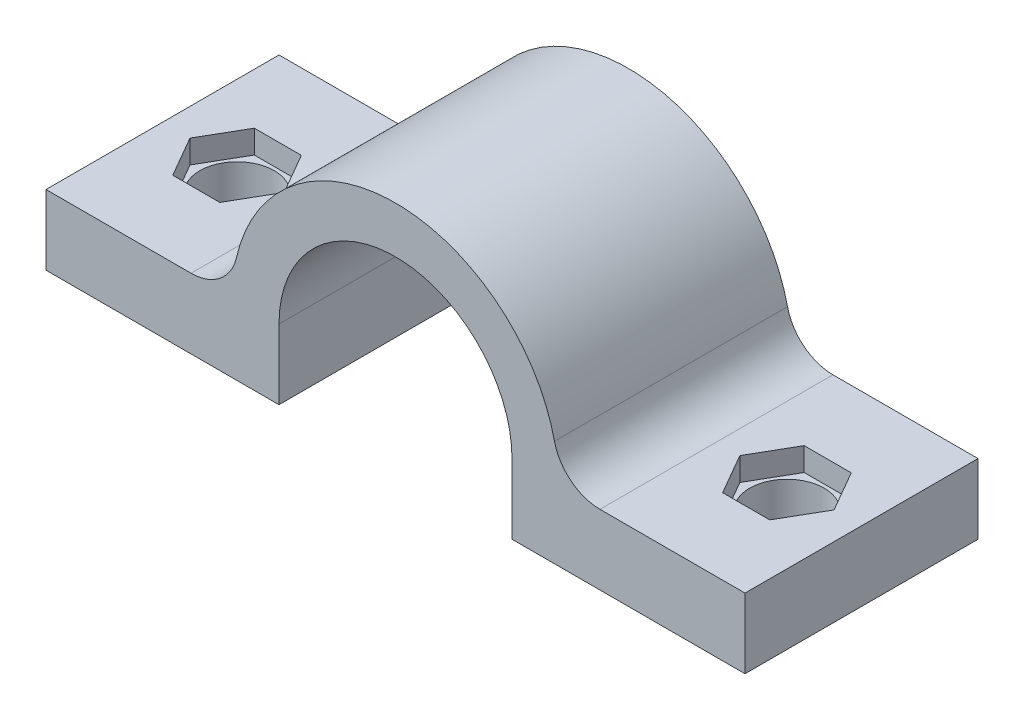
ISO-10303-21;
HEADER;
FILE_DESCRIPTION(('STEP AP214'),'2;1');
FILE_NAME('part.step','',(''),(''),'','','');
FILE_SCHEMA(('AUTOMOTIVE_DESIGN { 1 0 10303 214 1 1 1 1 }'));
ENDSEC;
DATA;
#1=APPLICATION_CONTEXT('core data for automotive mechanical design processes');
#2=APPLICATION_PROTOCOL_DEFINITION('international standard','automotive_design',2000,#1);
#3=PRODUCT_CONTEXT('',#1,'mechanical');
#4=PRODUCT('Part','Part','',(#3));
#5=PRODUCT_RELATED_PRODUCT_CATEGORY('part','',(#4));
#6=PRODUCT_DEFINITION_FORMATION('','',#4);
#7=PRODUCT_DEFINITION_CONTEXT('part definition',#1,'design');
#8=PRODUCT_DEFINITION('design','',#6,#7);
#9=PRODUCT_DEFINITION_SHAPE('','',#8);
#10=(LENGTH_UNIT() NAMED_UNIT(*) SI_UNIT(.MILLI.,.METRE.));
#11=(NAMED_UNIT(*) PLANE_ANGLE_UNIT() SI_UNIT($,.RADIAN.));
#12=(NAMED_UNIT(*) SI_UNIT($,.STERADIAN.) SOLID_ANGLE_UNIT());
#13=UNCERTAINTY_MEASURE_WITH_UNIT(LENGTH_MEASURE(1.E-05),#10,'distance_accuracy_value','');
#14=(GEOMETRIC_REPRESENTATION_CONTEXT(3) GLOBAL_UNCERTAINTY_ASSIGNED_CONTEXT((#13)) GLOBAL_UNIT_ASSIGNED_CONTEXT((#10,
#11,#12)) REPRESENTATION_CONTEXT('',''));
#15=CARTESIAN_POINT('',(0.,0.,0.));
#16=DIRECTION('',(0.,0.,1.));
#17=DIRECTION('',(1.,0.,0.));
#18=AXIS2_PLACEMENT_3D('',#15,#16,#17);
#19=CARTESIAN_POINT('',(11.8,-2.99999999999999,5.));
#20=DIRECTION('',(0.,1.,0.));
#21=DIRECTION('',(-1.,0.,0.));
#22=AXIS2_PLACEMENT_3D('',#19,#20,#21);
#23=CYLINDRICAL_SURFACE('',#22,1.6);
#24=CARTESIAN_POINT('',(11.8,-2.99999999999999,5.));
#25=DIRECTION('',(0.,1.,0.));
#26=DIRECTION('',(-1.,0.,0.));
#27=AXIS2_PLACEMENT_3D('',#24,#25,#26);
#28=CIRCLE('',#27,1.6);
#29=CARTESIAN_POINT('',(10.2,-2.99999999999999,5.));
#30=VERTEX_POINT('',#29);
#31=EDGE_CURVE('E301',#30,#30,#28,.T.);
#32=CARTESIAN_POINT('',(11.8,-1.,5.));
#33=DIRECTION('',(0.,1.,0.));
#34=DIRECTION('',(-1.,0.,0.));
#35=AXIS2_PLACEMENT_3D('',#32,#33,#34);
#36=CIRCLE('',#35,1.6);
#37=CARTESIAN_POINT('',(10.2,-1.,5.));
#38=VERTEX_POINT('',#37);
#39=EDGE_CURVE('E41',#38,#38,#36,.F.);
#40=CARTESIAN_POINT('',(10.2,-2.99999999999999,5.));
#41=CARTESIAN_POINT('',(10.2,-2.97916666666665,5.));
#42=CARTESIAN_POINT('',(10.2,-2.95833333333332,5.));
#43=CARTESIAN_POINT('',(10.2,-2.91666666666665,5.));
#44=CARTESIAN_POINT('',(10.2,-2.89583333333332,5.));
#45=CARTESIAN_POINT('',(10.2,-2.85416666666665,5.));
#46=CARTESIAN_POINT('',(10.2,-2.83333333333332,5.));
#47=CARTESIAN_POINT('',(10.2,-2.79166666666665,5.));
#48=CARTESIAN_POINT('',(10.2,-2.77083333333332,5.));
#49=CARTESIAN_POINT('',(10.2,-2.72916666666665,5.));
#50=CARTESIAN_POINT('',(10.2,-2.70833333333332,5.));
#51=CARTESIAN_POINT('',(10.2,-2.66666666666665,5.));
#52=CARTESIAN_POINT('',(10.2,-2.64583333333332,5.));
#53=CARTESIAN_POINT('',(10.2,-2.60416666666666,5.));
#54=CARTESIAN_POINT('',(10.2,-2.58333333333332,5.));
#55=CARTESIAN_POINT('',(10.2,-2.54166666666666,5.));
#56=CARTESIAN_POINT('',(10.2,-2.52083333333332,5.));
#57=CARTESIAN_POINT('',(10.2,-2.47916666666666,5.));
#58=CARTESIAN_POINT('',(10.2,-2.45833333333332,5.));
#59=CARTESIAN_POINT('',(10.2,-2.41666666666666,5.));
#60=CARTESIAN_POINT('',(10.2,-2.39583333333332,5.));
#61=CARTESIAN_POINT('',(10.2,-2.35416666666666,5.));
#62=CARTESIAN_POINT('',(10.2,-2.33333333333332,5.));
#63=CARTESIAN_POINT('',(10.2,-2.29166666666666,5.));
#64=CARTESIAN_POINT('',(10.2,-2.27083333333332,5.));
#65=CARTESIAN_POINT('',(10.2,-2.22916666666666,5.));
#66=CARTESIAN_POINT('',(10.2,-2.20833333333332,5.));
#67=CARTESIAN_POINT('',(10.2,-2.16666666666666,5.));
#68=CARTESIAN_POINT('',(10.2,-2.14583333333333,5.));
#69=CARTESIAN_POINT('',(10.2,-2.10416666666666,5.));
#70=CARTESIAN_POINT('',(10.2,-2.08333333333333,5.));
#71=CARTESIAN_POINT('',(10.2,-2.04166666666666,5.));
#72=CARTESIAN_POINT('',(10.2,-2.02083333333333,5.));
#73=CARTESIAN_POINT('',(10.2,-1.97916666666666,5.));
#74=CARTESIAN_POINT('',(10.2,-1.95833333333333,5.));
#75=CARTESIAN_POINT('',(10.2,-1.91666666666666,5.));
#76=CARTESIAN_POINT('',(10.2,-1.89583333333333,5.));
#77=CARTESIAN_POINT('',(10.2,-1.85416666666666,5.));
#78=CARTESIAN_POINT('',(10.2,-1.83333333333333,5.));
#79=CARTESIAN_POINT('',(10.2,-1.79166666666666,5.));
#80=CARTESIAN_POINT('',(10.2,-1.77083333333333,5.));
#81=CARTESIAN_POINT('',(10.2,-1.72916666666666,5.));
#82=CARTESIAN_POINT('',(10.2,-1.70833333333333,5.));
#83=CARTESIAN_POINT('',(10.2,-1.66666666666666,5.));
#84=CARTESIAN_POINT('',(10.2,-1.64583333333333,5.));
#85=CARTESIAN_POINT('',(10.2,-1.60416666666666,5.));
#86=CARTESIAN_POINT('',(10.2,-1.58333333333333,5.));
#87=CARTESIAN_POINT('',(10.2,-1.54166666666666,5.));
#88=CARTESIAN_POINT('',(10.2,-1.52083333333333,5.));
#89=CARTESIAN_POINT('',(10.2,-1.47916666666666,5.));
#90=CARTESIAN_POINT('',(10.2,-1.45833333333333,5.));
#91=CARTESIAN_POINT('',(10.2,-1.41666666666666,5.));
#92=CARTESIAN_POINT('',(10.2,-1.39583333333333,5.));
#93=CARTESIAN_POINT('',(10.2,-1.35416666666666,5.));
#94=CARTESIAN_POINT('',(10.2,-1.33333333333333,5.));
#95=CARTESIAN_POINT('',(10.2,-1.29166666666667,5.));
#96=CARTESIAN_POINT('',(10.2,-1.27083333333333,5.));
#97=CARTESIAN_POINT('',(10.2,-1.22916666666667,5.));
#98=CARTESIAN_POINT('',(10.2,-1.20833333333333,5.));
#99=CARTESIAN_POINT('',(10.2,-1.16666666666667,5.));
#100=CARTESIAN_POINT('',(10.2,-1.14583333333333,5.));
#101=CARTESIAN_POINT('',(10.2,-1.10416666666667,5.));
#102=CARTESIAN_POINT('',(10.2,-1.08333333333333,5.));
#103=CARTESIAN_POINT('',(10.2,-1.04166666666667,5.));
#104=CARTESIAN_POINT('',(10.2,-1.02083333333333,5.));
#105=CARTESIAN_POINT('',(10.2,-1.,5.));
#106=B_SPLINE_CURVE_WITH_KNOTS('',3,(#40,#41,#42,#43,#44,#45,#46,#47,#48,#49,#50,#51,#52,#53,
#54,#55,#56,#57,#58,#59,#60,#61,#62,#63,#64,#65,#66,#67,#68,#69,#70,#71,#72,#73,#74,#75,#76,#77,
#78,#79,#80,#81,#82,#83,#84,#85,#86,#87,#88,#89,#90,#91,#92,#93,#94,#95,#96,#97,#98,#99,#100,
#101,#102,#103,#104,#105),.UNSPECIFIED.,.F.,.F.,(4,2,2,2,2,2,2,2,2,2,2,2,2,2,2,2,2,2,2,2,2,2,2,
2,2,2,2,2,2,2,2,2,4),(0.,0.0624999999999996,0.124999999999999,0.187499999999999,
0.249999999999998,0.312499999999998,0.374999999999997,0.437499999999997,0.499999999999997,
0.562499999999996,0.624999999999995,0.687499999999995,0.749999999999995,0.812499999999994,
0.874999999999993,0.937499999999993,0.999999999999993,1.06249999999999,1.12499999999999,
1.18749999999999,1.24999999999999,1.31249999999999,1.37499999999999,1.43749999999999,
1.49999999999999,1.56249999999999,1.62499999999999,1.68749999999999,1.74999999999999,
1.81249999999999,1.87499999999999,1.93749999999999,1.99999999999998),.UNSPECIFIED.);
#107=EDGE_CURVE('BSEAM37',#30,#38,#106,.T.);
#108=ORIENTED_EDGE('',*,*,#31,.F.);
#109=ORIENTED_EDGE('',*,*,#39,.F.);
#110=ORIENTED_EDGE('',*,*,#107,.T.);
#111=ORIENTED_EDGE('',*,*,#107,.F.);
#112=EDGE_LOOP('',(#108,#110,#109,#111));
#113=FACE_BOUND('',#112,.T.);
#114=ADVANCED_FACE('F37',(#113),#23,.F.);
#115=CARTESIAN_POINT('',(-11.8,-2.99999999999999,5.));
#116=DIRECTION('',(0.,1.,0.));
#117=DIRECTION('',(-1.,0.,0.));
#118=AXIS2_PLACEMENT_3D('',#115,#116,#117);
#119=CYLINDRICAL_SURFACE('',#118,1.6);
#120=CARTESIAN_POINT('',(-11.8,-2.99999999999999,5.));
#121=DIRECTION('',(0.,1.,0.));
#122=DIRECTION('',(1.,0.,0.));
#123=AXIS2_PLACEMENT_3D('',#120,#121,#122);
#124=CIRCLE('',#123,1.6);
#125=CARTESIAN_POINT('',(-13.4,-2.99999999999999,5.));
#126=VERTEX_POINT('',#125);
#127=EDGE_CURVE('E305',#126,#126,#124,.T.);
#128=CARTESIAN_POINT('',(-11.8,-0.999999999999999,5.));
#129=DIRECTION('',(0.,1.,0.));
#130=DIRECTION('',(-1.,0.,0.));
#131=AXIS2_PLACEMENT_3D('',#128,#129,#130);
#132=CIRCLE('',#131,1.6);
#133=CARTESIAN_POINT('',(-13.4,-0.999999999999999,5.));
#134=VERTEX_POINT('',#133);
#135=EDGE_CURVE('E248',#134,#134,#132,.F.);
#136=CARTESIAN_POINT('',(-13.4,-2.99999999999999,5.));
#137=CARTESIAN_POINT('',(-13.4,-2.97916666666665,5.));
#138=CARTESIAN_POINT('',(-13.4,-2.95833333333332,5.));
#139=CARTESIAN_POINT('',(-13.4,-2.91666666666665,5.));
#140=CARTESIAN_POINT('',(-13.4,-2.89583333333332,5.));
#141=CARTESIAN_POINT('',(-13.4,-2.85416666666666,5.));
#142=CARTESIAN_POINT('',(-13.4,-2.83333333333332,5.));
#143=CARTESIAN_POINT('',(-13.4,-2.79166666666666,5.));
#144=CARTESIAN_POINT('',(-13.4,-2.77083333333332,5.));
#145=CARTESIAN_POINT('',(-13.4,-2.72916666666666,5.));
#146=CARTESIAN_POINT('',(-13.4,-2.70833333333332,5.));
#147=CARTESIAN_POINT('',(-13.4,-2.66666666666666,5.));
#148=CARTESIAN_POINT('',(-13.4,-2.64583333333332,5.));
#149=CARTESIAN_POINT('',(-13.4,-2.60416666666666,5.));
#150=CARTESIAN_POINT('',(-13.4,-2.58333333333332,5.));
#151=CARTESIAN_POINT('',(-13.4,-2.54166666666666,5.));
#152=CARTESIAN_POINT('',(-13.4,-2.52083333333332,5.));
#153=CARTESIAN_POINT('',(-13.4,-2.47916666666666,5.));
#154=CARTESIAN_POINT('',(-13.4,-2.45833333333332,5.));
#155=CARTESIAN_POINT('',(-13.4,-2.41666666666666,5.));
#156=CARTESIAN_POINT('',(-13.4,-2.39583333333332,5.));
#157=CARTESIAN_POINT('',(-13.4,-2.35416666666666,5.));
#158=CARTESIAN_POINT('',(-13.4,-2.33333333333333,5.));
#159=CARTESIAN_POINT('',(-13.4,-2.29166666666666,5.));
#160=CARTESIAN_POINT('',(-13.4,-2.27083333333333,5.));
#161=CARTESIAN_POINT('',(-13.4,-2.22916666666666,5.));
#162=CARTESIAN_POINT('',(-13.4,-2.20833333333333,5.));
#163=CARTESIAN_POINT('',(-13.4,-2.16666666666666,5.));
#164=CARTESIAN_POINT('',(-13.4,-2.14583333333333,5.));
#165=CARTESIAN_POINT('',(-13.4,-2.10416666666666,5.));
#166=CARTESIAN_POINT('',(-13.4,-2.08333333333333,5.));
#167=CARTESIAN_POINT('',(-13.4,-2.04166666666666,5.));
#168=CARTESIAN_POINT('',(-13.4,-2.02083333333333,5.));
#169=CARTESIAN_POINT('',(-13.4,-1.97916666666666,5.));
#170=CARTESIAN_POINT('',(-13.4,-1.95833333333333,5.));
#171=CARTESIAN_POINT('',(-13.4,-1.91666666666666,5.));
#172=CARTESIAN_POINT('',(-13.4,-1.89583333333333,5.));
#173=CARTESIAN_POINT('',(-13.4,-1.85416666666666,5.));
#174=CARTESIAN_POINT('',(-13.4,-1.83333333333333,5.));
#175=CARTESIAN_POINT('',(-13.4,-1.79166666666666,5.));
#176=CARTESIAN_POINT('',(-13.4,-1.77083333333333,5.));
#177=CARTESIAN_POINT('',(-13.4,-1.72916666666666,5.));
#178=CARTESIAN_POINT('',(-13.4,-1.70833333333333,5.));
#179=CARTESIAN_POINT('',(-13.4,-1.66666666666666,5.));
#180=CARTESIAN_POINT('',(-13.4,-1.64583333333333,5.));
#181=CARTESIAN_POINT('',(-13.4,-1.60416666666666,5.));
#182=CARTESIAN_POINT('',(-13.4,-1.58333333333333,5.));
#183=CARTESIAN_POINT('',(-13.4,-1.54166666666666,5.));
#184=CARTESIAN_POINT('',(-13.4,-1.52083333333333,5.));
#185=CARTESIAN_POINT('',(-13.4,-1.47916666666666,5.));
#186=CARTESIAN_POINT('',(-13.4,-1.45833333333333,5.));
#187=CARTESIAN_POINT('',(-13.4,-1.41666666666666,5.));
#188=CARTESIAN_POINT('',(-13.4,-1.39583333333333,5.));
#189=CARTESIAN_POINT('',(-13.4,-1.35416666666666,5.));
#190=CARTESIAN_POINT('',(-13.4,-1.33333333333333,5.));
#191=CARTESIAN_POINT('',(-13.4,-1.29166666666666,5.));
#192=CARTESIAN_POINT('',(-13.4,-1.27083333333333,5.));
#193=CARTESIAN_POINT('',(-13.4,-1.22916666666666,5.));
#194=CARTESIAN_POINT('',(-13.4,-1.20833333333333,5.));
#195=CARTESIAN_POINT('',(-13.4,-1.16666666666666,5.));
#196=CARTESIAN_POINT('',(-13.4,-1.14583333333333,5.));
#197=CARTESIAN_POINT('',(-13.4,-1.10416666666666,5.));
#198=CARTESIAN_POINT('',(-13.4,-1.08333333333333,5.));
#199=CARTESIAN_POINT('',(-13.4,-1.04166666666666,5.));
#200=CARTESIAN_POINT('',(-13.4,-1.02083333333333,5.));
#201=CARTESIAN_POINT('',(-13.4,-0.999999999999999,5.));
#202=B_SPLINE_CURVE_WITH_KNOTS('',3,(#136,#137,#138,#139,#140,#141,#142,#143,#144,#145,#146,
#147,#148,#149,#150,#151,#152,#153,#154,#155,#156,#157,#158,#159,#160,#161,#162,#163,#164,#165,
#166,#167,#168,#169,#170,#171,#172,#173,#174,#175,#176,#177,#178,#179,#180,#181,#182,#183,#184,
#185,#186,#187,#188,#189,#190,#191,#192,#193,#194,#195,#196,#197,#198,#199,#200,#201),
.UNSPECIFIED.,.F.,.F.,(4,2,2,2,2,2,2,2,2,2,2,2,2,2,2,2,2,2,2,2,2,2,2,2,2,2,2,2,2,2,2,2,4),(0.,
0.0625000000000001,0.125,0.187499999999999,0.249999999999999,0.312499999999999,
0.374999999999998,0.437499999999998,0.499999999999997,0.562499999999997,0.624999999999997,
0.687499999999997,0.749999999999996,0.812499999999996,0.874999999999996,0.937499999999995,
0.999999999999995,1.06249999999999,1.12499999999999,1.18749999999999,1.24999999999999,
1.31249999999999,1.37499999999999,1.43749999999999,1.49999999999999,1.56249999999999,
1.62499999999999,1.68749999999999,1.74999999999999,1.81249999999999,1.87499999999999,
1.93749999999999,1.99999999999999),.UNSPECIFIED.);
#203=EDGE_CURVE('BSEAM398',#126,#134,#202,.T.);
#204=ORIENTED_EDGE('',*,*,#127,.F.);
#205=ORIENTED_EDGE('',*,*,#135,.F.);
#206=ORIENTED_EDGE('',*,*,#203,.T.);
#207=ORIENTED_EDGE('',*,*,#203,.F.);
#208=EDGE_LOOP('',(#204,#206,#205,#207));
#209=FACE_BOUND('',#208,.T.);
#210=ADVANCED_FACE('F398',(#209),#119,.F.);
#211=CARTESIAN_POINT('',(0.,0.,10.));
#212=DIRECTION('',(0.,-1.,0.));
#213=DIRECTION('',(1.,0.,0.));
#214=AXIS2_PLACEMENT_3D('',#211,#212,#213);
#215=PLANE('',#214);
#216=DIRECTION('',(1.,0.,0.));
#217=VECTOR('',#216,1.);
#218=CARTESIAN_POINT('',(-12.8103629710818,0.,6.75));
#219=LINE('',#218,#217);
#220=CARTESIAN_POINT('',(-12.8103629710818,0.,6.75));
#221=VERTEX_POINT('',#220);
#222=CARTESIAN_POINT('',(-10.7896370289181,0.,6.75));
#223=VERTEX_POINT('',#222);
#224=EDGE_CURVE('E277',#221,#223,#219,.T.);
#225=ORIENTED_EDGE('',*,*,#224,.F.);
#226=DIRECTION('',(0.5,0.,0.866025403784438));
#227=VECTOR('',#226,1.);
#228=CARTESIAN_POINT('',(-13.8207259421637,0.,5.));
#229=LINE('',#228,#227);
#230=CARTESIAN_POINT('',(-13.8207259421637,0.,5.));
#231=VERTEX_POINT('',#230);
#232=EDGE_CURVE('E54',#231,#221,#229,.T.);
#233=ORIENTED_EDGE('',*,*,#232,.F.);
#234=DIRECTION('',(-0.5,0.,0.866025403784438));
#235=VECTOR('',#234,1.);
#236=CARTESIAN_POINT('',(-12.8103629710818,0.,3.25));
#237=LINE('',#236,#235);
#238=CARTESIAN_POINT('',(-12.8103629710818,0.,3.25));
#239=VERTEX_POINT('',#238);
#240=EDGE_CURVE('E260',#239,#231,#237,.T.);
#241=ORIENTED_EDGE('',*,*,#240,.F.);
#242=DIRECTION('',(-1.,0.,0.));
#243=VECTOR('',#242,1.);
#244=CARTESIAN_POINT('',(-10.7896370289182,0.,3.25));
#245=LINE('',#244,#243);
#246=CARTESIAN_POINT('',(-10.7896370289182,0.,3.25));
#247=VERTEX_POINT('',#246);
#248=EDGE_CURVE('E286',#247,#239,#245,.T.);
#249=ORIENTED_EDGE('',*,*,#248,.F.);
#250=DIRECTION('',(-0.500000000000001,0.,-0.866025403784438));
#251=VECTOR('',#250,1.);
#252=CARTESIAN_POINT('',(-9.7792740578363,0.,5.));
#253=LINE('',#252,#251);
#254=CARTESIAN_POINT('',(-9.7792740578363,0.,5.));
#255=VERTEX_POINT('',#254);
#256=EDGE_CURVE('E283',#255,#247,#253,.T.);
#257=ORIENTED_EDGE('',*,*,#256,.F.);
#258=DIRECTION('',(0.5,0.,-0.866025403784439));
#259=VECTOR('',#258,1.);
#260=CARTESIAN_POINT('',(-10.7896370289181,0.,6.75));
#261=LINE('',#260,#259);
#262=EDGE_CURVE('E280',#223,#255,#261,.T.);
#263=ORIENTED_EDGE('',*,*,#262,.F.);
#264=EDGE_LOOP('',(#225,#233,#241,#249,#257,#263));
#265=FACE_BOUND('',#264,.T.);
#266=DIRECTION('',(-1.,0.,0.));
#267=VECTOR('',#266,1.);
#268=CARTESIAN_POINT('',(0.,0.,10.));
#269=LINE('',#268,#267);
#270=CARTESIAN_POINT('',(-8.77496438739212,0.,10.));
#271=VERTEX_POINT('',#270);
#272=CARTESIAN_POINT('',(-15.,0.,10.));
#273=VERTEX_POINT('',#272);
#274=EDGE_CURVE('E308',#271,#273,#269,.T.);
#275=ORIENTED_EDGE('',*,*,#274,.F.);
#276=DIRECTION('',(0.,0.,-1.));
#277=VECTOR('',#276,1.);
#278=CARTESIAN_POINT('',(-8.77496438739212,0.,10.));
#279=LINE('',#278,#277);
#280=CARTESIAN_POINT('',(-8.77496438739212,0.,0.));
#281=VERTEX_POINT('',#280);
#282=EDGE_CURVE('E384',#271,#281,#279,.T.);
#283=ORIENTED_EDGE('',*,*,#282,.T.);
#284=DIRECTION('',(-1.,0.,0.));
#285=VECTOR('',#284,1.);
#286=CARTESIAN_POINT('',(0.,0.,0.));
#287=LINE('',#286,#285);
#288=CARTESIAN_POINT('',(-15.,0.,0.));
#289=VERTEX_POINT('',#288);
#290=EDGE_CURVE('E304',#281,#289,#287,.T.);
#291=ORIENTED_EDGE('',*,*,#290,.T.);
#292=DIRECTION('',(0.,0.,-1.));
#293=VECTOR('',#292,1.);
#294=CARTESIAN_POINT('',(-15.,0.,10.));
#295=LINE('',#294,#293);
#296=EDGE_CURVE('E374',#273,#289,#295,.T.);
#297=ORIENTED_EDGE('',*,*,#296,.F.);
#298=EDGE_LOOP('',(#275,#283,#291,#297));
#299=FACE_BOUND('',#298,.T.);
#300=ADVANCED_FACE('F404',(#265,#299),#215,.F.);
#301=CARTESIAN_POINT('',(-15.,0.,10.));
#302=DIRECTION('',(1.,0.,0.));
#303=DIRECTION('',(0.,0.,-1.));
#304=AXIS2_PLACEMENT_3D('',#301,#302,#303);
#305=PLANE('',#304);
#306=DIRECTION('',(0.,-1.,0.));
#307=VECTOR('',#306,1.);
#308=CARTESIAN_POINT('',(-15.,0.,0.));
#309=LINE('',#308,#307);
#310=CARTESIAN_POINT('',(-15.,-2.99999999999998,0.));
#311=VERTEX_POINT('',#310);
#312=EDGE_CURVE('E335',#289,#311,#309,.T.);
#313=ORIENTED_EDGE('',*,*,#312,.T.);
#314=DIRECTION('',(0.,0.,-1.));
#315=VECTOR('',#314,1.);
#316=CARTESIAN_POINT('',(-15.,-2.99999999999998,10.));
#317=LINE('',#316,#315);
#318=CARTESIAN_POINT('',(-15.,-2.99999999999998,10.));
#319=VERTEX_POINT('',#318);
#320=EDGE_CURVE('E372',#319,#311,#317,.T.);
#321=ORIENTED_EDGE('',*,*,#320,.F.);
#322=DIRECTION('',(0.,-1.,0.));
#323=VECTOR('',#322,1.);
#324=CARTESIAN_POINT('',(-15.,0.,10.));
#325=LINE('',#324,#323);
#326=EDGE_CURVE('E310',#273,#319,#325,.T.);
#327=ORIENTED_EDGE('',*,*,#326,.F.);
#328=ORIENTED_EDGE('',*,*,#296,.T.);
#329=EDGE_LOOP('',(#313,#321,#327,#328));
#330=FACE_BOUND('',#329,.T.);
#331=ADVANCED_FACE('F452',(#330),#305,.F.);
#332=CARTESIAN_POINT('',(0.,-2.99999999999998,10.));
#333=DIRECTION('',(0.,-1.,0.));
#334=DIRECTION('',(1.,0.,0.));
#335=AXIS2_PLACEMENT_3D('',#332,#333,#334);
#336=PLANE('',#335);
#337=ORIENTED_EDGE('',*,*,#127,.T.);
#338=EDGE_LOOP('',(#337));
#339=FACE_BOUND('',#338,.T.);
#340=DIRECTION('',(-1.,0.,0.));
#341=VECTOR('',#340,1.);
#342=CARTESIAN_POINT('',(0.,-2.99999999999998,0.));
#343=LINE('',#342,#341);
#344=CARTESIAN_POINT('',(-5.,-2.99999999999998,0.));
#345=VERTEX_POINT('',#344);
#346=EDGE_CURVE('E338',#345,#311,#343,.T.);
#347=ORIENTED_EDGE('',*,*,#346,.F.);
#348=DIRECTION('',(0.,0.,-1.));
#349=VECTOR('',#348,1.);
#350=CARTESIAN_POINT('',(-5.,-2.99999999999998,10.));
#351=LINE('',#350,#349);
#352=CARTESIAN_POINT('',(-5.,-2.99999999999998,10.));
#353=VERTEX_POINT('',#352);
#354=EDGE_CURVE('E370',#353,#345,#351,.T.);
#355=ORIENTED_EDGE('',*,*,#354,.F.);
#356=DIRECTION('',(-1.,0.,0.));
#357=VECTOR('',#356,1.);
#358=CARTESIAN_POINT('',(0.,-2.99999999999998,10.));
#359=LINE('',#358,#357);
#360=EDGE_CURVE('E313',#353,#319,#359,.T.);
#361=ORIENTED_EDGE('',*,*,#360,.T.);
#362=ORIENTED_EDGE('',*,*,#320,.T.);
#363=EDGE_LOOP('',(#347,#355,#361,#362));
#364=FACE_BOUND('',#363,.T.);
#365=ADVANCED_FACE('F448',(#339,#364),#336,.T.);
#366=CARTESIAN_POINT('',(-5.,0.,10.));
#367=DIRECTION('',(1.,0.,0.));
#368=DIRECTION('',(0.,0.,-1.));
#369=AXIS2_PLACEMENT_3D('',#366,#367,#368);
#370=PLANE('',#369);
#371=DIRECTION('',(0.,-1.,0.));
#372=VECTOR('',#371,1.);
#373=CARTESIAN_POINT('',(-5.,0.,0.));
#374=LINE('',#373,#372);
#375=CARTESIAN_POINT('',(-5.,0.,0.));
#376=VERTEX_POINT('',#375);
#377=EDGE_CURVE('E341',#376,#345,#374,.T.);
#378=ORIENTED_EDGE('',*,*,#377,.F.);
#379=DIRECTION('',(0.,0.,-1.));
#380=VECTOR('',#379,1.);
#381=CARTESIAN_POINT('',(-5.,0.,10.));
#382=LINE('',#381,#380);
#383=CARTESIAN_POINT('',(-5.,0.,10.));
#384=VERTEX_POINT('',#383);
#385=EDGE_CURVE('E368',#384,#376,#382,.T.);
#386=ORIENTED_EDGE('',*,*,#385,.F.);
#387=DIRECTION('',(0.,-1.,0.));
#388=VECTOR('',#387,1.);
#389=CARTESIAN_POINT('',(-5.,0.,10.));
#390=LINE('',#389,#388);
#391=EDGE_CURVE('E316',#384,#353,#390,.T.);
#392=ORIENTED_EDGE('',*,*,#391,.T.);
#393=ORIENTED_EDGE('',*,*,#354,.T.);
#394=EDGE_LOOP('',(#378,#386,#392,#393));
#395=FACE_BOUND('',#394,.T.);
#396=ADVANCED_FACE('F444',(#395),#370,.T.);
#397=CARTESIAN_POINT('',(0.,0.,10.));
#398=DIRECTION('',(0.,0.,-1.));
#399=DIRECTION('',(-1.,0.,0.));
#400=AXIS2_PLACEMENT_3D('',#397,#398,#399);
#401=CYLINDRICAL_SURFACE('',#400,5.);
#402=CARTESIAN_POINT('',(0.,0.,0.));
#403=DIRECTION('',(0.,0.,1.));
#404=DIRECTION('',(1.,0.,0.));
#405=AXIS2_PLACEMENT_3D('',#402,#403,#404);
#406=CIRCLE('',#405,5.);
#407=CARTESIAN_POINT('',(5.,0.,0.));
#408=VERTEX_POINT('',#407);
#409=EDGE_CURVE('E344',#376,#408,#406,.F.);
#410=ORIENTED_EDGE('',*,*,#409,.T.);
#411=DIRECTION('',(0.,0.,-1.));
#412=VECTOR('',#411,1.);
#413=CARTESIAN_POINT('',(5.,0.,10.));
#414=LINE('',#413,#412);
#415=CARTESIAN_POINT('',(5.,0.,10.));
#416=VERTEX_POINT('',#415);
#417=EDGE_CURVE('E365',#416,#408,#414,.T.);
#418=ORIENTED_EDGE('',*,*,#417,.F.);
#419=CARTESIAN_POINT('',(0.,0.,10.));
#420=DIRECTION('',(0.,0.,1.));
#421=DIRECTION('',(1.,0.,0.));
#422=AXIS2_PLACEMENT_3D('',#419,#420,#421);
#423=CIRCLE('',#422,5.);
#424=EDGE_CURVE('E319',#384,#416,#423,.F.);
#425=ORIENTED_EDGE('',*,*,#424,.F.);
#426=ORIENTED_EDGE('',*,*,#385,.T.);
#427=EDGE_LOOP('',(#410,#418,#425,#426));
#428=FACE_BOUND('',#427,.T.);
#429=ADVANCED_FACE('F440',(#428),#401,.F.);
#430=CARTESIAN_POINT('',(5.,0.,10.));
#431=DIRECTION('',(1.,0.,0.));
#432=DIRECTION('',(0.,0.,-1.));
#433=AXIS2_PLACEMENT_3D('',#430,#431,#432);
#434=PLANE('',#433);
#435=DIRECTION('',(0.,-1.,0.));
#436=VECTOR('',#435,1.);
#437=CARTESIAN_POINT('',(5.,0.,0.));
#438=LINE('',#437,#436);
#439=CARTESIAN_POINT('',(5.,-2.99999999999998,0.));
#440=VERTEX_POINT('',#439);
#441=EDGE_CURVE('E346',#408,#440,#438,.T.);
#442=ORIENTED_EDGE('',*,*,#441,.T.);
#443=DIRECTION('',(0.,0.,-1.));
#444=VECTOR('',#443,1.);
#445=CARTESIAN_POINT('',(5.,-2.99999999999998,10.));
#446=LINE('',#445,#444);
#447=CARTESIAN_POINT('',(5.,-2.99999999999998,10.));
#448=VERTEX_POINT('',#447);
#449=EDGE_CURVE('E362',#448,#440,#446,.T.);
#450=ORIENTED_EDGE('',*,*,#449,.F.);
#451=DIRECTION('',(0.,-1.,0.));
#452=VECTOR('',#451,1.);
#453=CARTESIAN_POINT('',(5.,0.,10.));
#454=LINE('',#453,#452);
#455=EDGE_CURVE('E321',#416,#448,#454,.T.);
#456=ORIENTED_EDGE('',*,*,#455,.F.);
#457=ORIENTED_EDGE('',*,*,#417,.T.);
#458=EDGE_LOOP('',(#442,#450,#456,#457));
#459=FACE_BOUND('',#458,.T.);
#460=ADVANCED_FACE('F436',(#459),#434,.F.);
#461=CARTESIAN_POINT('',(0.,-2.99999999999998,10.));
#462=DIRECTION('',(0.,1.,0.));
#463=DIRECTION('',(0.,0.,1.));
#464=AXIS2_PLACEMENT_3D('',#461,#462,#463);
#465=PLANE('',#464);
#466=ORIENTED_EDGE('',*,*,#31,.T.);
#467=EDGE_LOOP('',(#466));
#468=FACE_BOUND('',#467,.T.);
#469=DIRECTION('',(1.,0.,0.));
#470=VECTOR('',#469,1.);
#471=CARTESIAN_POINT('',(0.,-2.99999999999998,0.));
#472=LINE('',#471,#470);
#473=CARTESIAN_POINT('',(15.,-2.99999999999998,0.));
#474=VERTEX_POINT('',#473);
#475=EDGE_CURVE('E348',#440,#474,#472,.T.);
#476=ORIENTED_EDGE('',*,*,#475,.T.);
#477=DIRECTION('',(0.,0.,-1.));
#478=VECTOR('',#477,1.);
#479=CARTESIAN_POINT('',(15.,-2.99999999999998,10.));
#480=LINE('',#479,#478);
#481=CARTESIAN_POINT('',(15.,-2.99999999999998,10.));
#482=VERTEX_POINT('',#481);
#483=EDGE_CURVE('E360',#482,#474,#480,.T.);
#484=ORIENTED_EDGE('',*,*,#483,.F.);
#485=DIRECTION('',(1.,0.,0.));
#486=VECTOR('',#485,1.);
#487=CARTESIAN_POINT('',(0.,-2.99999999999998,10.));
#488=LINE('',#487,#486);
#489=EDGE_CURVE('E323',#448,#482,#488,.T.);
#490=ORIENTED_EDGE('',*,*,#489,.F.);
#491=ORIENTED_EDGE('',*,*,#449,.T.);
#492=EDGE_LOOP('',(#476,#484,#490,#491));
#493=FACE_BOUND('',#492,.T.);
#494=ADVANCED_FACE('F432',(#468,#493),#465,.F.);
#495=CARTESIAN_POINT('',(15.,0.,10.));
#496=DIRECTION('',(1.,0.,0.));
#497=DIRECTION('',(0.,0.,-1.));
#498=AXIS2_PLACEMENT_3D('',#495,#496,#497);
#499=PLANE('',#498);
#500=DIRECTION('',(0.,-1.,0.));
#501=VECTOR('',#500,1.);
#502=CARTESIAN_POINT('',(15.,0.,0.));
#503=LINE('',#502,#501);
#504=CARTESIAN_POINT('',(15.,0.,0.));
#505=VERTEX_POINT('',#504);
#506=EDGE_CURVE('E351',#505,#474,#503,.T.);
#507=ORIENTED_EDGE('',*,*,#506,.F.);
#508=DIRECTION('',(0.,0.,-1.));
#509=VECTOR('',#508,1.);
#510=CARTESIAN_POINT('',(15.,0.,10.));
#511=LINE('',#510,#509);
#512=CARTESIAN_POINT('',(15.,0.,10.));
#513=VERTEX_POINT('',#512);
#514=EDGE_CURVE('E333',#513,#505,#511,.T.);
#515=ORIENTED_EDGE('',*,*,#514,.F.);
#516=DIRECTION('',(0.,-1.,0.));
#517=VECTOR('',#516,1.);
#518=CARTESIAN_POINT('',(15.,0.,10.));
#519=LINE('',#518,#517);
#520=EDGE_CURVE('E325',#513,#482,#519,.T.);
#521=ORIENTED_EDGE('',*,*,#520,.T.);
#522=ORIENTED_EDGE('',*,*,#483,.T.);
#523=EDGE_LOOP('',(#507,#515,#521,#522));
#524=FACE_BOUND('',#523,.T.);
#525=ADVANCED_FACE('F428',(#524),#499,.T.);
#526=CARTESIAN_POINT('',(0.,0.,10.));
#527=DIRECTION('',(0.,1.,0.));
#528=DIRECTION('',(-1.,0.,0.));
#529=AXIS2_PLACEMENT_3D('',#526,#527,#528);
#530=PLANE('',#529);
#531=DIRECTION('',(0.500000000000001,0.,0.866025403784438));
#532=VECTOR('',#531,1.);
#533=CARTESIAN_POINT('',(9.77927405783631,0.,5.));
#534=LINE('',#533,#532);
#535=CARTESIAN_POINT('',(9.77927405783631,0.,5.));
#536=VERTEX_POINT('',#535);
#537=CARTESIAN_POINT('',(10.7896370289182,0.,6.75));
#538=VERTEX_POINT('',#537);
#539=EDGE_CURVE('E62',#536,#538,#534,.T.);
#540=ORIENTED_EDGE('',*,*,#539,.F.);
#541=DIRECTION('',(-0.5,0.,0.866025403784439));
#542=VECTOR('',#541,1.);
#543=CARTESIAN_POINT('',(10.7896370289182,0.,3.25));
#544=LINE('',#543,#542);
#545=CARTESIAN_POINT('',(10.7896370289182,0.,3.25));
#546=VERTEX_POINT('',#545);
#547=EDGE_CURVE('E221',#546,#536,#544,.T.);
#548=ORIENTED_EDGE('',*,*,#547,.F.);
#549=DIRECTION('',(-1.,0.,0.));
#550=VECTOR('',#549,1.);
#551=CARTESIAN_POINT('',(12.8103629710818,0.,3.25));
#552=LINE('',#551,#550);
#553=CARTESIAN_POINT('',(12.8103629710818,0.,3.25));
#554=VERTEX_POINT('',#553);
#555=EDGE_CURVE('E224',#554,#546,#552,.T.);
#556=ORIENTED_EDGE('',*,*,#555,.F.);
#557=DIRECTION('',(-0.5,0.,-0.866025403784439));
#558=VECTOR('',#557,1.);
#559=CARTESIAN_POINT('',(13.8207259421637,0.,5.));
#560=LINE('',#559,#558);
#561=CARTESIAN_POINT('',(13.8207259421637,0.,5.));
#562=VERTEX_POINT('',#561);
#563=EDGE_CURVE('E241',#562,#554,#560,.T.);
#564=ORIENTED_EDGE('',*,*,#563,.F.);
#565=DIRECTION('',(0.5,0.,-0.866025403784439));
#566=VECTOR('',#565,1.);
#567=CARTESIAN_POINT('',(12.8103629710818,0.,6.75));
#568=LINE('',#567,#566);
#569=CARTESIAN_POINT('',(12.8103629710818,0.,6.75));
#570=VERTEX_POINT('',#569);
#571=EDGE_CURVE('E238',#570,#562,#568,.T.);
#572=ORIENTED_EDGE('',*,*,#571,.F.);
#573=DIRECTION('',(1.,0.,0.));
#574=VECTOR('',#573,1.);
#575=CARTESIAN_POINT('',(10.7896370289182,0.,6.75));
#576=LINE('',#575,#574);
#577=EDGE_CURVE('E235',#538,#570,#576,.T.);
#578=ORIENTED_EDGE('',*,*,#577,.F.);
#579=EDGE_LOOP('',(#540,#548,#556,#564,#572,#578));
#580=FACE_BOUND('',#579,.T.);
#581=DIRECTION('',(1.,0.,0.));
#582=VECTOR('',#581,1.);
#583=CARTESIAN_POINT('',(0.,0.,0.));
#584=LINE('',#583,#582);
#585=CARTESIAN_POINT('',(8.77496438739212,0.,0.));
#586=VERTEX_POINT('',#585);
#587=EDGE_CURVE('E354',#586,#505,#584,.T.);
#588=ORIENTED_EDGE('',*,*,#587,.F.);
#589=DIRECTION('',(0.,0.,1.));
#590=VECTOR('',#589,1.);
#591=CARTESIAN_POINT('',(8.77496438739212,0.,10.));
#592=LINE('',#591,#590);
#593=CARTESIAN_POINT('',(8.77496438739212,0.,10.));
#594=VERTEX_POINT('',#593);
#595=EDGE_CURVE('E382',#586,#594,#592,.T.);
#596=ORIENTED_EDGE('',*,*,#595,.T.);
#597=DIRECTION('',(1.,0.,0.));
#598=VECTOR('',#597,1.);
#599=CARTESIAN_POINT('',(0.,0.,10.));
#600=LINE('',#599,#598);
#601=EDGE_CURVE('E328',#594,#513,#600,.T.);
#602=ORIENTED_EDGE('',*,*,#601,.T.);
#603=ORIENTED_EDGE('',*,*,#514,.T.);
#604=EDGE_LOOP('',(#588,#596,#602,#603));
#605=FACE_BOUND('',#604,.T.);
#606=ADVANCED_FACE('F424',(#580,#605),#530,.T.);
#607=CARTESIAN_POINT('',(0.,0.,10.));
#608=DIRECTION('',(0.,0.,-1.));
#609=DIRECTION('',(-1.,0.,0.));
#610=AXIS2_PLACEMENT_3D('',#607,#608,#609);
#611=CYLINDRICAL_SURFACE('',#610,7.);
#612=CARTESIAN_POINT('',(0.,0.,10.));
#613=DIRECTION('',(0.,0.,1.));
#614=DIRECTION('',(1.,0.,0.));
#615=AXIS2_PLACEMENT_3D('',#612,#613,#614);
#616=CIRCLE('',#615,7.);
#617=CARTESIAN_POINT('',(-6.82497230130498,1.55555555555555,10.));
#618=VERTEX_POINT('',#617);
#619=CARTESIAN_POINT('',(6.82497230130498,1.55555555555555,10.));
#620=VERTEX_POINT('',#619);
#621=EDGE_CURVE('E330',#618,#620,#616,.F.);
#622=ORIENTED_EDGE('',*,*,#621,.T.);
#623=DIRECTION('',(0.,0.,-1.));
#624=VECTOR('',#623,1.);
#625=CARTESIAN_POINT('',(6.82497230130498,1.55555555555555,10.));
#626=LINE('',#625,#624);
#627=CARTESIAN_POINT('',(6.82497230130498,1.55555555555555,0.));
#628=VERTEX_POINT('',#627);
#629=EDGE_CURVE('E379',#620,#628,#626,.T.);
#630=ORIENTED_EDGE('',*,*,#629,.T.);
#631=CARTESIAN_POINT('',(0.,0.,0.));
#632=DIRECTION('',(0.,0.,1.));
#633=DIRECTION('',(1.,0.,0.));
#634=AXIS2_PLACEMENT_3D('',#631,#632,#633);
#635=CIRCLE('',#634,7.);
#636=CARTESIAN_POINT('',(-6.82497230130498,1.55555555555555,0.));
#637=VERTEX_POINT('',#636);
#638=EDGE_CURVE('E311',#637,#628,#635,.F.);
#639=ORIENTED_EDGE('',*,*,#638,.F.);
#640=DIRECTION('',(0.,0.,-1.));
#641=VECTOR('',#640,1.);
#642=CARTESIAN_POINT('',(-6.82497230130498,1.55555555555555,10.));
#643=LINE('',#642,#641);
#644=EDGE_CURVE('E377',#637,#618,#643,.F.);
#645=ORIENTED_EDGE('',*,*,#644,.T.);
#646=EDGE_LOOP('',(#622,#630,#639,#645));
#647=FACE_BOUND('',#646,.T.);
#648=ADVANCED_FACE('F416',(#647),#611,.T.);
#649=CARTESIAN_POINT('',(0.,0.,10.));
#650=DIRECTION('',(0.,0.,1.));
#651=DIRECTION('',(1.,0.,0.));
#652=AXIS2_PLACEMENT_3D('',#649,#650,#651);
#653=PLANE('',#652);
#654=ORIENTED_EDGE('',*,*,#621,.F.);
#655=CARTESIAN_POINT('',(-8.77496438739212,2.,10.));
#656=DIRECTION('',(0.,0.,1.));
#657=DIRECTION('',(1.,0.,0.));
#658=AXIS2_PLACEMENT_3D('',#655,#656,#657);
#659=CIRCLE('',#658,2.);
#660=EDGE_CURVE('E11',#618,#271,#659,.F.);
#661=ORIENTED_EDGE('',*,*,#660,.T.);
#662=ORIENTED_EDGE('',*,*,#274,.T.);
#663=ORIENTED_EDGE('',*,*,#326,.T.);
#664=ORIENTED_EDGE('',*,*,#360,.F.);
#665=ORIENTED_EDGE('',*,*,#391,.F.);
#666=ORIENTED_EDGE('',*,*,#424,.T.);
#667=ORIENTED_EDGE('',*,*,#455,.T.);
#668=ORIENTED_EDGE('',*,*,#489,.T.);
#669=ORIENTED_EDGE('',*,*,#520,.F.);
#670=ORIENTED_EDGE('',*,*,#601,.F.);
#671=CARTESIAN_POINT('',(8.77496438739212,2.,10.));
#672=DIRECTION('',(0.,0.,1.));
#673=DIRECTION('',(1.,0.,0.));
#674=AXIS2_PLACEMENT_3D('',#671,#672,#673);
#675=CIRCLE('',#674,2.);
#676=EDGE_CURVE('E389',#594,#620,#675,.F.);
#677=ORIENTED_EDGE('',*,*,#676,.T.);
#678=EDGE_LOOP('',(#654,#661,#662,#663,#664,#665,#666,#667,#668,#669,#670,#677));
#679=FACE_BOUND('',#678,.T.);
#680=ADVANCED_FACE('F412',(#679),#653,.T.);
#681=CARTESIAN_POINT('',(0.,0.,0.));
#682=DIRECTION('',(0.,0.,1.));
#683=DIRECTION('',(1.,0.,0.));
#684=AXIS2_PLACEMENT_3D('',#681,#682,#683);
#685=PLANE('',#684);
#686=ORIENTED_EDGE('',*,*,#290,.F.);
#687=CARTESIAN_POINT('',(-8.77496438739212,2.,0.));
#688=DIRECTION('',(0.,0.,1.));
#689=DIRECTION('',(1.,0.,0.));
#690=AXIS2_PLACEMENT_3D('',#687,#688,#689);
#691=CIRCLE('',#690,2.);
#692=EDGE_CURVE('E46',#281,#637,#691,.T.);
#693=ORIENTED_EDGE('',*,*,#692,.T.);
#694=ORIENTED_EDGE('',*,*,#638,.T.);
#695=CARTESIAN_POINT('',(8.77496438739212,2.,0.));
#696=DIRECTION('',(0.,0.,1.));
#697=DIRECTION('',(1.,0.,0.));
#698=AXIS2_PLACEMENT_3D('',#695,#696,#697);
#699=CIRCLE('',#698,2.);
#700=EDGE_CURVE('E387',#628,#586,#699,.T.);
#701=ORIENTED_EDGE('',*,*,#700,.T.);
#702=ORIENTED_EDGE('',*,*,#587,.T.);
#703=ORIENTED_EDGE('',*,*,#506,.T.);
#704=ORIENTED_EDGE('',*,*,#475,.F.);
#705=ORIENTED_EDGE('',*,*,#441,.F.);
#706=ORIENTED_EDGE('',*,*,#409,.F.);
#707=ORIENTED_EDGE('',*,*,#377,.T.);
#708=ORIENTED_EDGE('',*,*,#346,.T.);
#709=ORIENTED_EDGE('',*,*,#312,.F.);
#710=EDGE_LOOP('',(#686,#693,#694,#701,#702,#703,#704,#705,#706,#707,#708,#709));
#711=FACE_BOUND('',#710,.T.);
#712=ADVANCED_FACE('F415',(#711),#685,.F.);
#713=CARTESIAN_POINT('',(8.77496438739212,2.,10.));
#714=DIRECTION('',(0.,0.,-1.));
#715=DIRECTION('',(-1.,0.,0.));
#716=AXIS2_PLACEMENT_3D('',#713,#714,#715);
#717=CYLINDRICAL_SURFACE('',#716,2.);
#718=ORIENTED_EDGE('',*,*,#676,.F.);
#719=ORIENTED_EDGE('',*,*,#595,.F.);
#720=ORIENTED_EDGE('',*,*,#700,.F.);
#721=ORIENTED_EDGE('',*,*,#629,.F.);
#722=EDGE_LOOP('',(#718,#719,#720,#721));
#723=FACE_BOUND('',#722,.T.);
#724=ADVANCED_FACE('F420',(#723),#717,.F.);
#725=CARTESIAN_POINT('',(-8.77496438739212,2.,10.));
#726=DIRECTION('',(0.,0.,-1.));
#727=DIRECTION('',(-1.,0.,0.));
#728=AXIS2_PLACEMENT_3D('',#725,#726,#727);
#729=CYLINDRICAL_SURFACE('',#728,2.);
#730=ORIENTED_EDGE('',*,*,#660,.F.);
#731=ORIENTED_EDGE('',*,*,#644,.F.);
#732=ORIENTED_EDGE('',*,*,#692,.F.);
#733=ORIENTED_EDGE('',*,*,#282,.F.);
#734=EDGE_LOOP('',(#730,#731,#732,#733));
#735=FACE_BOUND('',#734,.T.);
#736=ADVANCED_FACE('F39',(#735),#729,.F.);
#737=CARTESIAN_POINT('',(0.,-1.,0.));
#738=DIRECTION('',(0.,1.,0.));
#739=DIRECTION('',(-1.,0.,0.));
#740=AXIS2_PLACEMENT_3D('',#737,#738,#739);
#741=PLANE('',#740);
#742=DIRECTION('',(0.5,0.,0.866025403784438));
#743=VECTOR('',#742,1.);
#744=CARTESIAN_POINT('',(-13.8207259421637,-0.999999999999998,5.));
#745=LINE('',#744,#743);
#746=CARTESIAN_POINT('',(-13.8207259421637,-0.999999999999998,5.));
#747=VERTEX_POINT('',#746);
#748=CARTESIAN_POINT('',(-12.8103629710818,-0.999999999999999,6.75));
#749=VERTEX_POINT('',#748);
#750=EDGE_CURVE('E256',#747,#749,#745,.T.);
#751=ORIENTED_EDGE('',*,*,#750,.T.);
#752=DIRECTION('',(1.,0.,0.));
#753=VECTOR('',#752,1.);
#754=CARTESIAN_POINT('',(-12.8103629710818,-0.999999999999999,6.75));
#755=LINE('',#754,#753);
#756=CARTESIAN_POINT('',(-10.7896370289181,-0.999999999999999,6.75));
#757=VERTEX_POINT('',#756);
#758=EDGE_CURVE('E259',#749,#757,#755,.T.);
#759=ORIENTED_EDGE('',*,*,#758,.T.);
#760=DIRECTION('',(0.5,0.,-0.866025403784439));
#761=VECTOR('',#760,1.);
#762=CARTESIAN_POINT('',(-10.7896370289181,-0.999999999999999,6.75));
#763=LINE('',#762,#761);
#764=CARTESIAN_POINT('',(-9.7792740578363,-0.999999999999999,5.));
#765=VERTEX_POINT('',#764);
#766=EDGE_CURVE('E263',#757,#765,#763,.T.);
#767=ORIENTED_EDGE('',*,*,#766,.T.);
#768=DIRECTION('',(-0.500000000000001,0.,-0.866025403784438));
#769=VECTOR('',#768,1.);
#770=CARTESIAN_POINT('',(-9.7792740578363,-0.999999999999999,5.));
#771=LINE('',#770,#769);
#772=CARTESIAN_POINT('',(-10.7896370289182,-0.999999999999999,3.25));
#773=VERTEX_POINT('',#772);
#774=EDGE_CURVE('E266',#765,#773,#771,.T.);
#775=ORIENTED_EDGE('',*,*,#774,.T.);
#776=DIRECTION('',(-1.,0.,0.));
#777=VECTOR('',#776,1.);
#778=CARTESIAN_POINT('',(-10.7896370289182,-0.999999999999999,3.25));
#779=LINE('',#778,#777);
#780=CARTESIAN_POINT('',(-12.8103629710818,-0.999999999999999,3.25));
#781=VERTEX_POINT('',#780);
#782=EDGE_CURVE('E269',#773,#781,#779,.T.);
#783=ORIENTED_EDGE('',*,*,#782,.T.);
#784=DIRECTION('',(-0.5,0.,0.866025403784438));
#785=VECTOR('',#784,1.);
#786=CARTESIAN_POINT('',(-12.8103629710818,-0.999999999999999,3.25));
#787=LINE('',#786,#785);
#788=EDGE_CURVE('E272',#781,#747,#787,.T.);
#789=ORIENTED_EDGE('',*,*,#788,.T.);
#790=EDGE_LOOP('',(#751,#759,#767,#775,#783,#789));
#791=FACE_BOUND('',#790,.T.);
#792=ORIENTED_EDGE('',*,*,#135,.T.);
#793=EDGE_LOOP('',(#792));
#794=FACE_BOUND('',#793,.T.);
#795=ADVANCED_FACE('F464',(#791,#794),#741,.T.);
#796=CARTESIAN_POINT('',(-13.8207259421637,-0.999999999999998,5.));
#797=DIRECTION('',(-0.866025403784438,0.,0.5));
#798=DIRECTION('',(0.5,0.,0.866025403784438));
#799=AXIS2_PLACEMENT_3D('',#796,#797,#798);
#800=PLANE('',#799);
#801=ORIENTED_EDGE('',*,*,#232,.T.);
#802=DIRECTION('',(0.,1.,0.));
#803=VECTOR('',#802,1.);
#804=CARTESIAN_POINT('',(-12.8103629710818,-0.999999999999999,6.75));
#805=LINE('',#804,#803);
#806=EDGE_CURVE('E275',#749,#221,#805,.T.);
#807=ORIENTED_EDGE('',*,*,#806,.F.);
#808=ORIENTED_EDGE('',*,*,#750,.F.);
#809=DIRECTION('',(0.,1.,0.));
#810=VECTOR('',#809,1.);
#811=CARTESIAN_POINT('',(-13.8207259421637,-0.999999999999998,5.));
#812=LINE('',#811,#810);
#813=EDGE_CURVE('E236',#747,#231,#812,.T.);
#814=ORIENTED_EDGE('',*,*,#813,.T.);
#815=EDGE_LOOP('',(#801,#807,#808,#814));
#816=FACE_BOUND('',#815,.T.);
#817=ADVANCED_FACE('F409',(#816),#800,.F.);
#818=CARTESIAN_POINT('',(-12.8103629710818,-0.999999999999999,3.25));
#819=DIRECTION('',(-0.866025403784438,0.,-0.5));
#820=DIRECTION('',(-0.5,0.,0.866025403784438));
#821=AXIS2_PLACEMENT_3D('',#818,#819,#820);
#822=PLANE('',#821);
#823=ORIENTED_EDGE('',*,*,#240,.T.);
#824=ORIENTED_EDGE('',*,*,#813,.F.);
#825=ORIENTED_EDGE('',*,*,#788,.F.);
#826=DIRECTION('',(0.,1.,0.));
#827=VECTOR('',#826,1.);
#828=CARTESIAN_POINT('',(-12.8103629710818,-0.999999999999999,3.25));
#829=LINE('',#828,#827);
#830=EDGE_CURVE('E292',#781,#239,#829,.T.);
#831=ORIENTED_EDGE('',*,*,#830,.T.);
#832=EDGE_LOOP('',(#823,#824,#825,#831));
#833=FACE_BOUND('',#832,.T.);
#834=ADVANCED_FACE('F510',(#833),#822,.F.);
#835=CARTESIAN_POINT('',(-10.7896370289182,-0.999999999999999,3.25));
#836=DIRECTION('',(0.,0.,-1.));
#837=DIRECTION('',(-1.,0.,0.));
#838=AXIS2_PLACEMENT_3D('',#835,#836,#837);
#839=PLANE('',#838);
#840=ORIENTED_EDGE('',*,*,#248,.T.);
#841=ORIENTED_EDGE('',*,*,#830,.F.);
#842=ORIENTED_EDGE('',*,*,#782,.F.);
#843=DIRECTION('',(0.,1.,0.));
#844=VECTOR('',#843,1.);
#845=CARTESIAN_POINT('',(-10.7896370289182,-0.999999999999999,3.25));
#846=LINE('',#845,#844);
#847=EDGE_CURVE('E294',#773,#247,#846,.T.);
#848=ORIENTED_EDGE('',*,*,#847,.T.);
#849=EDGE_LOOP('',(#840,#841,#842,#848));
#850=FACE_BOUND('',#849,.T.);
#851=ADVANCED_FACE('F516',(#850),#839,.F.);
#852=CARTESIAN_POINT('',(-9.7792740578363,-0.999999999999999,5.));
#853=DIRECTION('',(0.866025403784438,0.,-0.500000000000001));
#854=DIRECTION('',(-0.500000000000001,0.,-0.866025403784438));
#855=AXIS2_PLACEMENT_3D('',#852,#853,#854);
#856=PLANE('',#855);
#857=ORIENTED_EDGE('',*,*,#256,.T.);
#858=ORIENTED_EDGE('',*,*,#847,.F.);
#859=ORIENTED_EDGE('',*,*,#774,.F.);
#860=DIRECTION('',(0.,1.,0.));
#861=VECTOR('',#860,1.);
#862=CARTESIAN_POINT('',(-9.7792740578363,-0.999999999999999,5.));
#863=LINE('',#862,#861);
#864=EDGE_CURVE('E296',#765,#255,#863,.T.);
#865=ORIENTED_EDGE('',*,*,#864,.T.);
#866=EDGE_LOOP('',(#857,#858,#859,#865));
#867=FACE_BOUND('',#866,.T.);
#868=ADVANCED_FACE('F520',(#867),#856,.F.);
#869=CARTESIAN_POINT('',(-10.7896370289181,-0.999999999999999,6.75));
#870=DIRECTION('',(0.866025403784439,0.,0.5));
#871=DIRECTION('',(0.5,0.,-0.866025403784439));
#872=AXIS2_PLACEMENT_3D('',#869,#870,#871);
#873=PLANE('',#872);
#874=ORIENTED_EDGE('',*,*,#262,.T.);
#875=ORIENTED_EDGE('',*,*,#864,.F.);
#876=ORIENTED_EDGE('',*,*,#766,.F.);
#877=DIRECTION('',(0.,1.,0.));
#878=VECTOR('',#877,1.);
#879=CARTESIAN_POINT('',(-10.7896370289181,-0.999999999999999,6.75));
#880=LINE('',#879,#878);
#881=EDGE_CURVE('E298',#757,#223,#880,.T.);
#882=ORIENTED_EDGE('',*,*,#881,.T.);
#883=EDGE_LOOP('',(#874,#875,#876,#882));
#884=FACE_BOUND('',#883,.T.);
#885=ADVANCED_FACE('F524',(#884),#873,.F.);
#886=CARTESIAN_POINT('',(-12.8103629710818,-0.999999999999999,6.75));
#887=DIRECTION('',(0.,0.,1.));
#888=DIRECTION('',(1.,0.,0.));
#889=AXIS2_PLACEMENT_3D('',#886,#887,#888);
#890=PLANE('',#889);
#891=ORIENTED_EDGE('',*,*,#224,.T.);
#892=ORIENTED_EDGE('',*,*,#881,.F.);
#893=ORIENTED_EDGE('',*,*,#758,.F.);
#894=ORIENTED_EDGE('',*,*,#806,.T.);
#895=EDGE_LOOP('',(#891,#892,#893,#894));
#896=FACE_BOUND('',#895,.T.);
#897=ADVANCED_FACE('F527',(#896),#890,.F.);
#898=CARTESIAN_POINT('',(0.,-1.,0.));
#899=DIRECTION('',(0.,1.,0.));
#900=DIRECTION('',(-1.,0.,0.));
#901=AXIS2_PLACEMENT_3D('',#898,#899,#900);
#902=PLANE('',#901);
#903=DIRECTION('',(0.500000000000001,0.,0.866025403784438));
#904=VECTOR('',#903,1.);
#905=CARTESIAN_POINT('',(9.77927405783631,-1.,5.));
#906=LINE('',#905,#904);
#907=CARTESIAN_POINT('',(9.77927405783631,-1.,5.));
#908=VERTEX_POINT('',#907);
#909=CARTESIAN_POINT('',(10.7896370289182,-1.,6.75));
#910=VERTEX_POINT('',#909);
#911=EDGE_CURVE('E201',#908,#910,#906,.T.);
#912=ORIENTED_EDGE('',*,*,#911,.T.);
#913=DIRECTION('',(1.,0.,0.));
#914=VECTOR('',#913,1.);
#915=CARTESIAN_POINT('',(10.7896370289182,-1.,6.75));
#916=LINE('',#915,#914);
#917=CARTESIAN_POINT('',(12.8103629710818,-1.,6.75));
#918=VERTEX_POINT('',#917);
#919=EDGE_CURVE('E210',#910,#918,#916,.T.);
#920=ORIENTED_EDGE('',*,*,#919,.T.);
#921=DIRECTION('',(0.5,0.,-0.866025403784439));
#922=VECTOR('',#921,1.);
#923=CARTESIAN_POINT('',(12.8103629710818,-1.,6.75));
#924=LINE('',#923,#922);
#925=CARTESIAN_POINT('',(13.8207259421637,-1.,5.));
#926=VERTEX_POINT('',#925);
#927=EDGE_CURVE('E215',#918,#926,#924,.T.);
#928=ORIENTED_EDGE('',*,*,#927,.T.);
#929=DIRECTION('',(-0.5,0.,-0.866025403784439));
#930=VECTOR('',#929,1.);
#931=CARTESIAN_POINT('',(13.8207259421637,-1.,5.));
#932=LINE('',#931,#930);
#933=CARTESIAN_POINT('',(12.8103629710818,-1.,3.25));
#934=VERTEX_POINT('',#933);
#935=EDGE_CURVE('E228',#926,#934,#932,.T.);
#936=ORIENTED_EDGE('',*,*,#935,.T.);
#937=DIRECTION('',(-1.,0.,0.));
#938=VECTOR('',#937,1.);
#939=CARTESIAN_POINT('',(12.8103629710818,-1.,3.25));
#940=LINE('',#939,#938);
#941=CARTESIAN_POINT('',(10.7896370289182,-1.,3.25));
#942=VERTEX_POINT('',#941);
#943=EDGE_CURVE('E231',#934,#942,#940,.T.);
#944=ORIENTED_EDGE('',*,*,#943,.T.);
#945=DIRECTION('',(-0.5,0.,0.866025403784439));
#946=VECTOR('',#945,1.);
#947=CARTESIAN_POINT('',(10.7896370289182,-1.,3.25));
#948=LINE('',#947,#946);
#949=EDGE_CURVE('E207',#942,#908,#948,.T.);
#950=ORIENTED_EDGE('',*,*,#949,.T.);
#951=EDGE_LOOP('',(#912,#920,#928,#936,#944,#950));
#952=FACE_BOUND('',#951,.T.);
#953=ORIENTED_EDGE('',*,*,#39,.T.);
#954=EDGE_LOOP('',(#953));
#955=FACE_BOUND('',#954,.T.);
#956=ADVANCED_FACE('F217',(#952,#955),#902,.T.);
#957=CARTESIAN_POINT('',(9.77927405783631,-1.,5.));
#958=DIRECTION('',(-0.866025403784438,0.,0.500000000000001));
#959=DIRECTION('',(0.500000000000001,0.,0.866025403784438));
#960=AXIS2_PLACEMENT_3D('',#957,#958,#959);
#961=PLANE('',#960);
#962=ORIENTED_EDGE('',*,*,#539,.T.);
#963=DIRECTION('',(0.,1.,0.));
#964=VECTOR('',#963,1.);
#965=CARTESIAN_POINT('',(10.7896370289182,-1.,6.75));
#966=LINE('',#965,#964);
#967=EDGE_CURVE('E197',#910,#538,#966,.T.);
#968=ORIENTED_EDGE('',*,*,#967,.F.);
#969=ORIENTED_EDGE('',*,*,#911,.F.);
#970=DIRECTION('',(0.,1.,0.));
#971=VECTOR('',#970,1.);
#972=CARTESIAN_POINT('',(9.77927405783631,-1.,5.));
#973=LINE('',#972,#971);
#974=EDGE_CURVE('E246',#908,#536,#973,.T.);
#975=ORIENTED_EDGE('',*,*,#974,.T.);
#976=EDGE_LOOP('',(#962,#968,#969,#975));
#977=FACE_BOUND('',#976,.T.);
#978=ADVANCED_FACE('F199',(#977),#961,.F.);
#979=CARTESIAN_POINT('',(10.7896370289182,-1.,3.25));
#980=DIRECTION('',(-0.866025403784439,0.,-0.5));
#981=DIRECTION('',(-0.5,0.,0.866025403784439));
#982=AXIS2_PLACEMENT_3D('',#979,#980,#981);
#983=PLANE('',#982);
#984=ORIENTED_EDGE('',*,*,#547,.T.);
#985=ORIENTED_EDGE('',*,*,#974,.F.);
#986=ORIENTED_EDGE('',*,*,#949,.F.);
#987=DIRECTION('',(0.,1.,0.));
#988=VECTOR('',#987,1.);
#989=CARTESIAN_POINT('',(10.7896370289182,-1.,3.25));
#990=LINE('',#989,#988);
#991=EDGE_CURVE('E249',#942,#546,#990,.T.);
#992=ORIENTED_EDGE('',*,*,#991,.T.);
#993=EDGE_LOOP('',(#984,#985,#986,#992));
#994=FACE_BOUND('',#993,.T.);
#995=ADVANCED_FACE('F549',(#994),#983,.F.);
#996=CARTESIAN_POINT('',(12.8103629710818,-1.,3.25));
#997=DIRECTION('',(0.,0.,-1.));
#998=DIRECTION('',(-1.,0.,0.));
#999=AXIS2_PLACEMENT_3D('',#996,#997,#998);
#1000=PLANE('',#999);
#1001=ORIENTED_EDGE('',*,*,#555,.T.);
#1002=ORIENTED_EDGE('',*,*,#991,.F.);
#1003=ORIENTED_EDGE('',*,*,#943,.F.);
#1004=DIRECTION('',(0.,1.,0.));
#1005=VECTOR('',#1004,1.);
#1006=CARTESIAN_POINT('',(12.8103629710818,-1.,3.25));
#1007=LINE('',#1006,#1005);
#1008=EDGE_CURVE('E251',#934,#554,#1007,.T.);
#1009=ORIENTED_EDGE('',*,*,#1008,.T.);
#1010=EDGE_LOOP('',(#1001,#1002,#1003,#1009));
#1011=FACE_BOUND('',#1010,.T.);
#1012=ADVANCED_FACE('F553',(#1011),#1000,.F.);
#1013=CARTESIAN_POINT('',(13.8207259421637,-1.,5.));
#1014=DIRECTION('',(0.866025403784439,0.,-0.5));
#1015=DIRECTION('',(-0.5,0.,-0.866025403784439));
#1016=AXIS2_PLACEMENT_3D('',#1013,#1014,#1015);
#1017=PLANE('',#1016);
#1018=ORIENTED_EDGE('',*,*,#563,.T.);
#1019=ORIENTED_EDGE('',*,*,#1008,.F.);
#1020=ORIENTED_EDGE('',*,*,#935,.F.);
#1021=DIRECTION('',(0.,1.,0.));
#1022=VECTOR('',#1021,1.);
#1023=CARTESIAN_POINT('',(13.8207259421637,-1.,5.));
#1024=LINE('',#1023,#1022);
#1025=EDGE_CURVE('E253',#926,#562,#1024,.T.);
#1026=ORIENTED_EDGE('',*,*,#1025,.T.);
#1027=EDGE_LOOP('',(#1018,#1019,#1020,#1026));
#1028=FACE_BOUND('',#1027,.T.);
#1029=ADVANCED_FACE('F557',(#1028),#1017,.F.);
#1030=CARTESIAN_POINT('',(12.8103629710818,-1.,6.75));
#1031=DIRECTION('',(0.866025403784439,0.,0.5));
#1032=DIRECTION('',(0.5,0.,-0.866025403784439));
#1033=AXIS2_PLACEMENT_3D('',#1030,#1031,#1032);
#1034=PLANE('',#1033);
#1035=ORIENTED_EDGE('',*,*,#571,.T.);
#1036=ORIENTED_EDGE('',*,*,#1025,.F.);
#1037=ORIENTED_EDGE('',*,*,#927,.F.);
#1038=DIRECTION('',(0.,1.,0.));
#1039=VECTOR('',#1038,1.);
#1040=CARTESIAN_POINT('',(12.8103629710818,-1.,6.75));
#1041=LINE('',#1040,#1039);
#1042=EDGE_CURVE('E206',#918,#570,#1041,.T.);
#1043=ORIENTED_EDGE('',*,*,#1042,.T.);
#1044=EDGE_LOOP('',(#1035,#1036,#1037,#1043));
#1045=FACE_BOUND('',#1044,.T.);
#1046=ADVANCED_FACE('F561',(#1045),#1034,.F.);
#1047=CARTESIAN_POINT('',(10.7896370289182,-1.,6.75));
#1048=DIRECTION('',(0.,0.,1.));
#1049=DIRECTION('',(1.,0.,0.));
#1050=AXIS2_PLACEMENT_3D('',#1047,#1048,#1049);
#1051=PLANE('',#1050);
#1052=ORIENTED_EDGE('',*,*,#577,.T.);
#1053=ORIENTED_EDGE('',*,*,#1042,.F.);
#1054=ORIENTED_EDGE('',*,*,#919,.F.);
#1055=ORIENTED_EDGE('',*,*,#967,.T.);
#1056=EDGE_LOOP('',(#1052,#1053,#1054,#1055));
#1057=FACE_BOUND('',#1056,.T.);
#1058=ADVANCED_FACE('F211',(#1057),#1051,.F.);
#1059=CLOSED_SHELL('',(#114,#210,#300,#331,#365,#396,#429,#460,#494,#525,#606,#648,#680,#712,
#724,#736,#795,#817,#834,#851,#868,#885,#897,#956,#978,#995,#1012,#1029,#1046,#1058));
#1060=MANIFOLD_SOLID_BREP('B2',#1059);
#1061=ADVANCED_BREP_SHAPE_REPRESENTATION('',(#18,#1060),#14);
#1062=SHAPE_DEFINITION_REPRESENTATION(#9,#1061);
ENDSEC;
END-ISO-10303-21;
